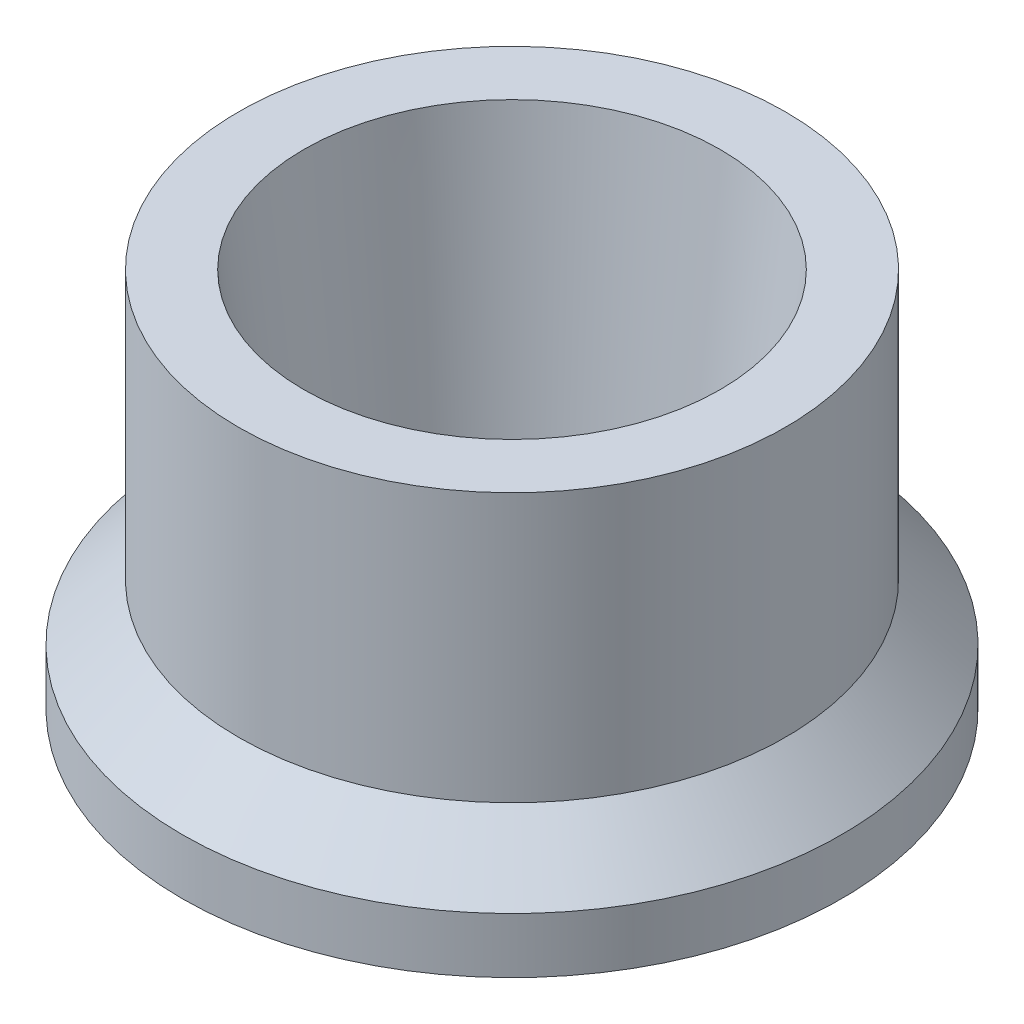
ISO-10303-21;
HEADER;
FILE_DESCRIPTION(('STEP AP214'),'2;1');
FILE_NAME('part.step','',(''),(''),'','','');
FILE_SCHEMA(('AUTOMOTIVE_DESIGN { 1 0 10303 214 1 1 1 1 }'));
ENDSEC;
DATA;
#1=APPLICATION_CONTEXT('core data for automotive mechanical design processes');
#2=APPLICATION_PROTOCOL_DEFINITION('international standard','automotive_design',2000,#1);
#3=PRODUCT_CONTEXT('',#1,'mechanical');
#4=PRODUCT('Part','Part','',(#3));
#5=PRODUCT_RELATED_PRODUCT_CATEGORY('part','',(#4));
#6=PRODUCT_DEFINITION_FORMATION('','',#4);
#7=PRODUCT_DEFINITION_CONTEXT('part definition',#1,'design');
#8=PRODUCT_DEFINITION('design','',#6,#7);
#9=PRODUCT_DEFINITION_SHAPE('','',#8);
#10=(LENGTH_UNIT() NAMED_UNIT(*) SI_UNIT(.MILLI.,.METRE.));
#11=(NAMED_UNIT(*) PLANE_ANGLE_UNIT() SI_UNIT($,.RADIAN.));
#12=(NAMED_UNIT(*) SI_UNIT($,.STERADIAN.) SOLID_ANGLE_UNIT());
#13=UNCERTAINTY_MEASURE_WITH_UNIT(LENGTH_MEASURE(1.E-05),#10,'distance_accuracy_value','');
#14=(GEOMETRIC_REPRESENTATION_CONTEXT(3) GLOBAL_UNCERTAINTY_ASSIGNED_CONTEXT((#13)) GLOBAL_UNIT_ASSIGNED_CONTEXT((#10,
#11,#12)) REPRESENTATION_CONTEXT('',''));
#15=CARTESIAN_POINT('',(0.,0.,0.));
#16=DIRECTION('',(0.,0.,1.));
#17=DIRECTION('',(1.,0.,0.));
#18=AXIS2_PLACEMENT_3D('',#15,#16,#17);
#19=CARTESIAN_POINT('',(6.0325,0.,0.));
#20=DIRECTION('',(0.,-1.,0.));
#21=DIRECTION('',(0.,0.,-1.));
#22=AXIS2_PLACEMENT_3D('',#19,#20,#21);
#23=PLANE('',#22);
#24=CARTESIAN_POINT('',(0.,0.,0.));
#25=DIRECTION('',(0.,-1.,0.));
#26=DIRECTION('',(0.,0.,-1.));
#27=AXIS2_PLACEMENT_3D('',#24,#25,#26);
#28=CIRCLE('',#27,6.0325);
#29=CARTESIAN_POINT('',(0.,0.,-6.0325));
#30=VERTEX_POINT('',#29);
#31=EDGE_CURVE('E10',#30,#30,#28,.T.);
#32=ORIENTED_EDGE('',*,*,#31,.T.);
#33=EDGE_LOOP('',(#32));
#34=FACE_BOUND('',#33,.T.);
#35=CARTESIAN_POINT('',(0.,0.,0.));
#36=DIRECTION('',(0.,-1.,0.));
#37=DIRECTION('',(0.,0.,-1.));
#38=AXIS2_PLACEMENT_3D('',#35,#36,#37);
#39=CIRCLE('',#38,3.048);
#40=CARTESIAN_POINT('',(0.,0.,-3.048));
#41=VERTEX_POINT('',#40);
#42=EDGE_CURVE('E53',#41,#41,#39,.T.);
#43=ORIENTED_EDGE('',*,*,#42,.F.);
#44=EDGE_LOOP('',(#43));
#45=FACE_BOUND('',#44,.T.);
#46=ADVANCED_FACE('F31',(#34,#45),#23,.T.);
#47=CARTESIAN_POINT('',(0.,0.,0.));
#48=DIRECTION('',(0.,-1.,0.));
#49=DIRECTION('',(0.,0.,-1.));
#50=AXIS2_PLACEMENT_3D('',#47,#48,#49);
#51=CYLINDRICAL_SURFACE('',#50,6.0325);
#52=CARTESIAN_POINT('',(0.,1.016,0.));
#53=DIRECTION('',(0.,-1.,0.));
#54=DIRECTION('',(0.,0.,-1.));
#55=AXIS2_PLACEMENT_3D('',#52,#53,#54);
#56=CIRCLE('',#55,6.0325);
#57=CARTESIAN_POINT('',(0.,1.016,-6.0325));
#58=VERTEX_POINT('',#57);
#59=EDGE_CURVE('E37',#58,#58,#56,.T.);
#60=ORIENTED_EDGE('',*,*,#59,.T.);
#61=EDGE_LOOP('',(#60));
#62=FACE_BOUND('',#61,.T.);
#63=ORIENTED_EDGE('',*,*,#31,.F.);
#64=EDGE_LOOP('',(#63));
#65=FACE_BOUND('',#64,.T.);
#66=ADVANCED_FACE('F61',(#62,#65),#51,.T.);
#67=CARTESIAN_POINT('',(0.,1.016,0.));
#68=DIRECTION('',(0.,-1.,0.));
#69=DIRECTION('',(0.,0.,-1.));
#70=AXIS2_PLACEMENT_3D('',#67,#68,#69);
#71=CONICAL_SURFACE('',#70,6.0325,0.78539816339745);
#72=CARTESIAN_POINT('',(0.,2.0447,0.));
#73=DIRECTION('',(0.,-1.,0.));
#74=DIRECTION('',(0.,0.,-1.));
#75=AXIS2_PLACEMENT_3D('',#72,#73,#74);
#76=CIRCLE('',#75,5.0038);
#77=CARTESIAN_POINT('',(0.,2.0447,-5.0038));
#78=VERTEX_POINT('',#77);
#79=EDGE_CURVE('E41',#78,#78,#76,.T.);
#80=ORIENTED_EDGE('',*,*,#79,.T.);
#81=EDGE_LOOP('',(#80));
#82=FACE_BOUND('',#81,.T.);
#83=ORIENTED_EDGE('',*,*,#59,.F.);
#84=EDGE_LOOP('',(#83));
#85=FACE_BOUND('',#84,.T.);
#86=ADVANCED_FACE('F65',(#82,#85),#71,.T.);
#87=CARTESIAN_POINT('',(0.,0.,0.));
#88=DIRECTION('',(0.,-1.,0.));
#89=DIRECTION('',(0.,0.,-1.));
#90=AXIS2_PLACEMENT_3D('',#87,#88,#89);
#91=CYLINDRICAL_SURFACE('',#90,5.0038);
#92=CARTESIAN_POINT('',(0.,6.9596,0.));
#93=DIRECTION('',(0.,-1.,0.));
#94=DIRECTION('',(0.,0.,-1.));
#95=AXIS2_PLACEMENT_3D('',#92,#93,#94);
#96=CIRCLE('',#95,5.0038);
#97=CARTESIAN_POINT('',(0.,6.9596,-5.0038));
#98=VERTEX_POINT('',#97);
#99=EDGE_CURVE('E45',#98,#98,#96,.T.);
#100=ORIENTED_EDGE('',*,*,#99,.T.);
#101=EDGE_LOOP('',(#100));
#102=FACE_BOUND('',#101,.T.);
#103=ORIENTED_EDGE('',*,*,#79,.F.);
#104=EDGE_LOOP('',(#103));
#105=FACE_BOUND('',#104,.T.);
#106=ADVANCED_FACE('F69',(#102,#105),#91,.T.);
#107=CARTESIAN_POINT('',(3.81,6.9596,0.));
#108=DIRECTION('',(0.,1.,0.));
#109=DIRECTION('',(0.,0.,1.));
#110=AXIS2_PLACEMENT_3D('',#107,#108,#109);
#111=PLANE('',#110);
#112=CARTESIAN_POINT('',(0.,6.9596,0.));
#113=DIRECTION('',(0.,-1.,0.));
#114=DIRECTION('',(0.,0.,-1.));
#115=AXIS2_PLACEMENT_3D('',#112,#113,#114);
#116=CIRCLE('',#115,3.81);
#117=CARTESIAN_POINT('',(0.,6.9596,-3.81));
#118=VERTEX_POINT('',#117);
#119=EDGE_CURVE('E50',#118,#118,#116,.T.);
#120=ORIENTED_EDGE('',*,*,#119,.T.);
#121=EDGE_LOOP('',(#120));
#122=FACE_BOUND('',#121,.T.);
#123=ORIENTED_EDGE('',*,*,#99,.F.);
#124=EDGE_LOOP('',(#123));
#125=FACE_BOUND('',#124,.T.);
#126=ADVANCED_FACE('F76',(#122,#125),#111,.T.);
#127=CARTESIAN_POINT('',(0.,6.9596,0.));
#128=DIRECTION('',(0.,1.,0.));
#129=DIRECTION('',(0.,0.,1.));
#130=AXIS2_PLACEMENT_3D('',#127,#128,#129);
#131=CONICAL_SURFACE('',#130,3.81,0.109054658443237);
#132=ORIENTED_EDGE('',*,*,#42,.T.);
#133=EDGE_LOOP('',(#132));
#134=FACE_BOUND('',#133,.T.);
#135=ORIENTED_EDGE('',*,*,#119,.F.);
#136=EDGE_LOOP('',(#135));
#137=FACE_BOUND('',#136,.T.);
#138=ADVANCED_FACE('F57',(#134,#137),#131,.F.);
#139=CLOSED_SHELL('',(#46,#66,#86,#106,#126,#138));
#140=MANIFOLD_SOLID_BREP('B2',#139);
#141=ADVANCED_BREP_SHAPE_REPRESENTATION('',(#18,#140),#14);
#142=SHAPE_DEFINITION_REPRESENTATION(#9,#141);
ENDSEC;
END-ISO-10303-21;
